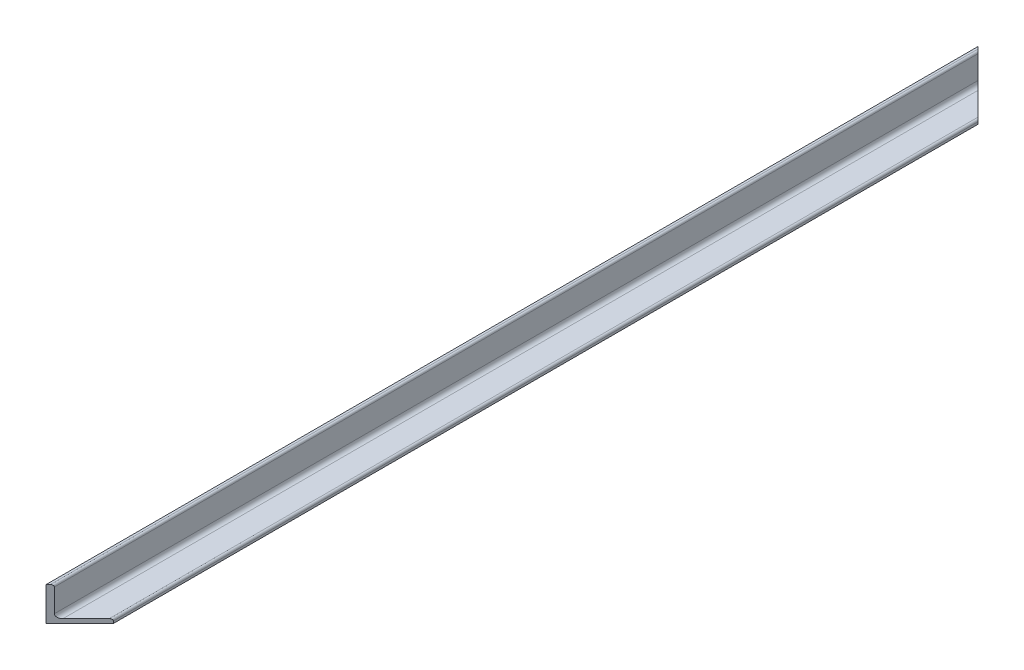
ISO-10303-21;
HEADER;
FILE_DESCRIPTION(('STEP AP214'),'2;1');
FILE_NAME('part.step','',(''),(''),'','','');
FILE_SCHEMA(('AUTOMOTIVE_DESIGN { 1 0 10303 214 1 1 1 1 }'));
ENDSEC;
DATA;
#1=APPLICATION_CONTEXT('core data for automotive mechanical design processes');
#2=APPLICATION_PROTOCOL_DEFINITION('international standard','automotive_design',2000,#1);
#3=PRODUCT_CONTEXT('',#1,'mechanical');
#4=PRODUCT('Part','Part','',(#3));
#5=PRODUCT_RELATED_PRODUCT_CATEGORY('part','',(#4));
#6=PRODUCT_DEFINITION_FORMATION('','',#4);
#7=PRODUCT_DEFINITION_CONTEXT('part definition',#1,'design');
#8=PRODUCT_DEFINITION('design','',#6,#7);
#9=PRODUCT_DEFINITION_SHAPE('','',#8);
#10=(LENGTH_UNIT() NAMED_UNIT(*) SI_UNIT(.MILLI.,.METRE.));
#11=(NAMED_UNIT(*) PLANE_ANGLE_UNIT() SI_UNIT($,.RADIAN.));
#12=(NAMED_UNIT(*) SI_UNIT($,.STERADIAN.) SOLID_ANGLE_UNIT());
#13=UNCERTAINTY_MEASURE_WITH_UNIT(LENGTH_MEASURE(1.E-05),#10,'distance_accuracy_value','');
#14=(GEOMETRIC_REPRESENTATION_CONTEXT(3) GLOBAL_UNCERTAINTY_ASSIGNED_CONTEXT((#13)) GLOBAL_UNIT_ASSIGNED_CONTEXT((#10,
#11,#12)) REPRESENTATION_CONTEXT('',''));
#15=CARTESIAN_POINT('',(0.,0.,0.));
#16=DIRECTION('',(0.,0.,1.));
#17=DIRECTION('',(1.,0.,0.));
#18=AXIS2_PLACEMENT_3D('',#15,#16,#17);
#19=CARTESIAN_POINT('',(-4.99999762E-08,0.,4.99999762E-08));
#20=DIRECTION('',(-0.707106781186547,0.,0.707106781186548));
#21=DIRECTION('',(0.707106781186548,0.,0.707106781186547));
#22=AXIS2_PLACEMENT_3D('',#19,#20,#21);
#23=PLANE('',#22);
#24=DIRECTION('',(-0.707106781186548,0.,-0.707106781186547));
#25=VECTOR('',#24,1.);
#26=CARTESIAN_POINT('',(2.4765,38.1,2.47650009999995));
#27=LINE('',#26,#25);
#28=CARTESIAN_POINT('',(2.4765,38.1,2.47650009999995));
#29=VERTEX_POINT('',#28);
#30=CARTESIAN_POINT('',(-1.22995654402062E-08,38.1,3.33697533511504E-08));
#31=VERTEX_POINT('',#30);
#32=EDGE_CURVE('E34',#29,#31,#27,.T.);
#33=ORIENTED_EDGE('',*,*,#32,.F.);
#34=CARTESIAN_POINT('',(2.4765,35.814,2.47650009999995));
#35=DIRECTION('',(-0.707106781186547,0.,0.707106781186548));
#36=DIRECTION('',(-0.707106781186548,0.,-0.707106781186547));
#37=AXIS2_PLACEMENT_3D('',#34,#35,#36);
#38=ELLIPSE('',#37,3.23289220358488,2.286);
#39=CARTESIAN_POINT('',(4.7625,35.814,4.76250009999995));
#40=VERTEX_POINT('',#39);
#41=EDGE_CURVE('E130',#40,#29,#38,.T.);
#42=ORIENTED_EDGE('',*,*,#41,.F.);
#43=DIRECTION('',(0.,1.,0.));
#44=VECTOR('',#43,1.);
#45=CARTESIAN_POINT('',(4.7625,9.5885,4.76250009999995));
#46=LINE('',#45,#44);
#47=CARTESIAN_POINT('',(4.7625,9.5885,4.76250009999995));
#48=VERTEX_POINT('',#47);
#49=EDGE_CURVE('E137',#48,#40,#46,.T.);
#50=ORIENTED_EDGE('',*,*,#49,.F.);
#51=CARTESIAN_POINT('',(9.5885,9.5885,9.58850009999995));
#52=DIRECTION('',(0.707106781186547,0.,-0.707106781186548));
#53=DIRECTION('',(-0.707106781186548,0.,-0.707106781186547));
#54=AXIS2_PLACEMENT_3D('',#51,#52,#53);
#55=ELLIPSE('',#54,6.82499465201256,4.826);
#56=CARTESIAN_POINT('',(9.5885,4.7625,9.58850009999995));
#57=VERTEX_POINT('',#56);
#58=EDGE_CURVE('E144',#57,#48,#55,.T.);
#59=ORIENTED_EDGE('',*,*,#58,.F.);
#60=DIRECTION('',(-0.707106781186548,0.,-0.707106781186547));
#61=VECTOR('',#60,1.);
#62=CARTESIAN_POINT('',(35.814,4.7625,35.8140000999999));
#63=LINE('',#62,#61);
#64=CARTESIAN_POINT('',(35.814,4.7625,35.8140000999999));
#65=VERTEX_POINT('',#64);
#66=EDGE_CURVE('E26',#65,#57,#63,.T.);
#67=ORIENTED_EDGE('',*,*,#66,.F.);
#68=CARTESIAN_POINT('',(35.814,2.47650000000003,35.8140000999999));
#69=DIRECTION('',(-0.707106781186547,0.,0.707106781186548));
#70=DIRECTION('',(-0.707106781186548,0.,-0.707106781186547));
#71=AXIS2_PLACEMENT_3D('',#68,#69,#70);
#72=ELLIPSE('',#71,3.23289220358488,2.286);
#73=CARTESIAN_POINT('',(38.1,2.47650000000003,38.1000000999999));
#74=VERTEX_POINT('',#73);
#75=EDGE_CURVE('E123',#74,#65,#72,.T.);
#76=ORIENTED_EDGE('',*,*,#75,.F.);
#77=DIRECTION('',(0.,1.,0.));
#78=VECTOR('',#77,1.);
#79=CARTESIAN_POINT('',(38.1,0.,38.1000001));
#80=LINE('',#79,#78);
#81=CARTESIAN_POINT('',(38.1,0.,38.1000000999999));
#82=VERTEX_POINT('',#81);
#83=EDGE_CURVE('E102',#82,#74,#80,.T.);
#84=ORIENTED_EDGE('',*,*,#83,.F.);
#85=DIRECTION('',(0.707106781186548,0.,0.707106781186547));
#86=VECTOR('',#85,1.);
#87=CARTESIAN_POINT('',(-4.99999773102231E-08,0.,4.9999975089777E-08));
#88=LINE('',#87,#86);
#89=CARTESIAN_POINT('',(-1.2299562351499E-08,0.,3.33697530782527E-08));
#90=VERTEX_POINT('',#89);
#91=EDGE_CURVE('E95',#90,#82,#88,.T.);
#92=ORIENTED_EDGE('',*,*,#91,.F.);
#93=DIRECTION('',(0.,1.,0.));
#94=VECTOR('',#93,1.);
#95=CARTESIAN_POINT('',(0.,0.,0.));
#96=LINE('',#95,#94);
#97=EDGE_CURVE('E10',#90,#31,#96,.T.);
#98=ORIENTED_EDGE('',*,*,#97,.T.);
#99=EDGE_LOOP('',(#33,#42,#50,#59,#67,#76,#84,#92,#98));
#100=FACE_BOUND('',#99,.T.);
#101=ADVANCED_FACE('F16',(#100),#23,.F.);
#102=CARTESIAN_POINT('',(9.5885,4.7625,0.));
#103=DIRECTION('',(0.,1.,0.));
#104=DIRECTION('',(0.,0.,1.));
#105=AXIS2_PLACEMENT_3D('',#102,#103,#104);
#106=PLANE('',#105);
#107=ORIENTED_EDGE('',*,*,#66,.T.);
#108=DIRECTION('',(0.,0.,1.));
#109=VECTOR('',#108,1.);
#110=CARTESIAN_POINT('',(9.5885,4.7625,9.58850009999995));
#111=LINE('',#110,#109);
#112=CARTESIAN_POINT('',(9.5885,4.7625,1044.5114999));
#113=VERTEX_POINT('',#112);
#114=EDGE_CURVE('E148',#57,#113,#111,.T.);
#115=ORIENTED_EDGE('',*,*,#114,.T.);
#116=DIRECTION('',(0.707106781186548,0.,-0.707106781186547));
#117=VECTOR('',#116,1.);
#118=CARTESIAN_POINT('',(9.58849999999993,4.7625,1044.5114999));
#119=LINE('',#118,#117);
#120=CARTESIAN_POINT('',(35.814,4.7625,1018.2859999));
#121=VERTEX_POINT('',#120);
#122=EDGE_CURVE('E146',#113,#121,#119,.T.);
#123=ORIENTED_EDGE('',*,*,#122,.T.);
#124=DIRECTION('',(0.,0.,1.));
#125=VECTOR('',#124,1.);
#126=CARTESIAN_POINT('',(35.814,4.7625,35.8140000999999));
#127=LINE('',#126,#125);
#128=EDGE_CURVE('E100',#65,#121,#127,.T.);
#129=ORIENTED_EDGE('',*,*,#128,.F.);
#130=EDGE_LOOP('',(#107,#115,#123,#129));
#131=FACE_BOUND('',#130,.T.);
#132=ADVANCED_FACE('F179',(#131),#106,.T.);
#133=CARTESIAN_POINT('',(9.5885,9.5885,0.));
#134=DIRECTION('',(0.,0.,1.));
#135=DIRECTION('',(1.,0.,0.));
#136=AXIS2_PLACEMENT_3D('',#133,#134,#135);
#137=CYLINDRICAL_SURFACE('',#136,4.826);
#138=ORIENTED_EDGE('',*,*,#58,.T.);
#139=DIRECTION('',(0.,0.,1.));
#140=VECTOR('',#139,1.);
#141=CARTESIAN_POINT('',(4.7625,9.5885,4.76250009999995));
#142=LINE('',#141,#140);
#143=CARTESIAN_POINT('',(4.7625,9.5885,1049.3374999));
#144=VERTEX_POINT('',#143);
#145=EDGE_CURVE('E141',#48,#144,#142,.T.);
#146=ORIENTED_EDGE('',*,*,#145,.T.);
#147=CARTESIAN_POINT('',(9.5885,9.5885,1044.5114999));
#148=DIRECTION('',(0.707106781186548,0.,0.707106781186548));
#149=DIRECTION('',(-0.707106781186548,0.,0.707106781186548));
#150=AXIS2_PLACEMENT_3D('',#147,#148,#149);
#151=ELLIPSE('',#150,6.82499465201256,4.826);
#152=EDGE_CURVE('E138',#144,#113,#151,.T.);
#153=ORIENTED_EDGE('',*,*,#152,.T.);
#154=ORIENTED_EDGE('',*,*,#114,.F.);
#155=EDGE_LOOP('',(#138,#146,#153,#154));
#156=FACE_BOUND('',#155,.T.);
#157=ADVANCED_FACE('F175',(#156),#137,.F.);
#158=CARTESIAN_POINT('',(4.7625,35.814,0.));
#159=DIRECTION('',(1.,0.,0.));
#160=DIRECTION('',(0.,0.,-1.));
#161=AXIS2_PLACEMENT_3D('',#158,#159,#160);
#162=PLANE('',#161);
#163=ORIENTED_EDGE('',*,*,#49,.T.);
#164=DIRECTION('',(0.,0.,1.));
#165=VECTOR('',#164,1.);
#166=CARTESIAN_POINT('',(4.7625,35.814,4.76250009999995));
#167=LINE('',#166,#165);
#168=CARTESIAN_POINT('',(4.7625,35.814,1049.3374999));
#169=VERTEX_POINT('',#168);
#170=EDGE_CURVE('E134',#40,#169,#167,.T.);
#171=ORIENTED_EDGE('',*,*,#170,.T.);
#172=DIRECTION('',(0.,-1.,0.));
#173=VECTOR('',#172,1.);
#174=CARTESIAN_POINT('',(4.7625,35.814,1049.3374999));
#175=LINE('',#174,#173);
#176=EDGE_CURVE('E131',#169,#144,#175,.T.);
#177=ORIENTED_EDGE('',*,*,#176,.T.);
#178=ORIENTED_EDGE('',*,*,#145,.F.);
#179=EDGE_LOOP('',(#163,#171,#177,#178));
#180=FACE_BOUND('',#179,.T.);
#181=ADVANCED_FACE('F173',(#180),#162,.T.);
#182=CARTESIAN_POINT('',(2.4765,35.814,0.));
#183=DIRECTION('',(0.,0.,1.));
#184=DIRECTION('',(1.,0.,0.));
#185=AXIS2_PLACEMENT_3D('',#182,#183,#184);
#186=CYLINDRICAL_SURFACE('',#185,2.286);
#187=ORIENTED_EDGE('',*,*,#41,.T.);
#188=DIRECTION('',(0.,0.,1.));
#189=VECTOR('',#188,1.);
#190=CARTESIAN_POINT('',(2.4765,38.1,2.47650009999995));
#191=LINE('',#190,#189);
#192=CARTESIAN_POINT('',(2.4765,38.1,1051.6234999));
#193=VERTEX_POINT('',#192);
#194=EDGE_CURVE('E127',#29,#193,#191,.T.);
#195=ORIENTED_EDGE('',*,*,#194,.T.);
#196=CARTESIAN_POINT('',(2.4765,35.814,1051.6234999));
#197=DIRECTION('',(-0.707106781186548,0.,-0.707106781186548));
#198=DIRECTION('',(-0.707106781186548,0.,0.707106781186548));
#199=AXIS2_PLACEMENT_3D('',#196,#197,#198);
#200=ELLIPSE('',#199,3.23289220358491,2.286);
#201=EDGE_CURVE('E124',#193,#169,#200,.T.);
#202=ORIENTED_EDGE('',*,*,#201,.T.);
#203=ORIENTED_EDGE('',*,*,#170,.F.);
#204=EDGE_LOOP('',(#187,#195,#202,#203));
#205=FACE_BOUND('',#204,.T.);
#206=ADVANCED_FACE('F170',(#205),#186,.T.);
#207=CARTESIAN_POINT('',(527.04999995,0.,527.04999995));
#208=DIRECTION('',(-0.707106781186548,0.,-0.707106781186547));
#209=DIRECTION('',(-0.707106781186547,0.,0.707106781186548));
#210=AXIS2_PLACEMENT_3D('',#207,#208,#209);
#211=PLANE('',#210);
#212=ORIENTED_EDGE('',*,*,#122,.F.);
#213=ORIENTED_EDGE('',*,*,#152,.F.);
#214=ORIENTED_EDGE('',*,*,#176,.F.);
#215=ORIENTED_EDGE('',*,*,#201,.F.);
#216=DIRECTION('',(0.707106781186526,0.,-0.707106781186569));
#217=VECTOR('',#216,1.);
#218=CARTESIAN_POINT('',(-5.00000797771497E-08,38.1,1054.09999995));
#219=LINE('',#218,#217);
#220=CARTESIAN_POINT('',(-1.22995897440961E-08,38.1,1054.09999996663));
#221=VERTEX_POINT('',#220);
#222=EDGE_CURVE('E120',#221,#193,#219,.T.);
#223=ORIENTED_EDGE('',*,*,#222,.F.);
#224=DIRECTION('',(0.,1.,0.));
#225=VECTOR('',#224,1.);
#226=CARTESIAN_POINT('',(0.,0.,1054.1));
#227=LINE('',#226,#225);
#228=CARTESIAN_POINT('',(-1.22995893100016E-08,0.,1054.09999996663));
#229=VERTEX_POINT('',#228);
#230=EDGE_CURVE('E114',#229,#221,#227,.T.);
#231=ORIENTED_EDGE('',*,*,#230,.F.);
#232=DIRECTION('',(-0.707106781186546,0.,0.707106781186549));
#233=VECTOR('',#232,1.);
#234=CARTESIAN_POINT('',(38.1,0.,1015.9999999));
#235=LINE('',#234,#233);
#236=CARTESIAN_POINT('',(38.1,0.,1015.9999999));
#237=VERTEX_POINT('',#236);
#238=EDGE_CURVE('E83',#237,#229,#235,.T.);
#239=ORIENTED_EDGE('',*,*,#238,.F.);
#240=DIRECTION('',(0.,-1.,0.));
#241=VECTOR('',#240,1.);
#242=CARTESIAN_POINT('',(38.1,2.47650000000003,1015.9999999));
#243=LINE('',#242,#241);
#244=CARTESIAN_POINT('',(38.1,2.47650000000003,1015.9999999));
#245=VERTEX_POINT('',#244);
#246=EDGE_CURVE('E86',#245,#237,#243,.T.);
#247=ORIENTED_EDGE('',*,*,#246,.F.);
#248=CARTESIAN_POINT('',(35.814,2.47650000000003,1018.2859999));
#249=DIRECTION('',(-0.707106781186548,0.,-0.707106781186547));
#250=DIRECTION('',(-0.707106781186547,0.,0.707106781186548));
#251=AXIS2_PLACEMENT_3D('',#248,#249,#250);
#252=ELLIPSE('',#251,3.23289220358491,2.286);
#253=EDGE_CURVE('E89',#121,#245,#252,.T.);
#254=ORIENTED_EDGE('',*,*,#253,.F.);
#255=EDGE_LOOP('',(#212,#213,#214,#215,#223,#231,#239,#247,#254));
#256=FACE_BOUND('',#255,.T.);
#257=ADVANCED_FACE('F88',(#256),#211,.F.);
#258=CARTESIAN_POINT('',(0.,38.1,0.));
#259=DIRECTION('',(0.,1.,0.));
#260=DIRECTION('',(0.,0.,1.));
#261=AXIS2_PLACEMENT_3D('',#258,#259,#260);
#262=PLANE('',#261);
#263=ORIENTED_EDGE('',*,*,#32,.T.);
#264=DIRECTION('',(0.,0.,1.));
#265=VECTOR('',#264,1.);
#266=CARTESIAN_POINT('',(0.,38.1,0.));
#267=LINE('',#266,#265);
#268=EDGE_CURVE('E110',#31,#221,#267,.T.);
#269=ORIENTED_EDGE('',*,*,#268,.T.);
#270=ORIENTED_EDGE('',*,*,#222,.T.);
#271=ORIENTED_EDGE('',*,*,#194,.F.);
#272=EDGE_LOOP('',(#263,#269,#270,#271));
#273=FACE_BOUND('',#272,.T.);
#274=ADVANCED_FACE('F163',(#273),#262,.T.);
#275=CARTESIAN_POINT('',(35.814,2.47650000000003,0.));
#276=DIRECTION('',(0.,0.,1.));
#277=DIRECTION('',(1.,0.,0.));
#278=AXIS2_PLACEMENT_3D('',#275,#276,#277);
#279=CYLINDRICAL_SURFACE('',#278,2.286);
#280=ORIENTED_EDGE('',*,*,#75,.T.);
#281=ORIENTED_EDGE('',*,*,#128,.T.);
#282=ORIENTED_EDGE('',*,*,#253,.T.);
#283=DIRECTION('',(0.,0.,1.));
#284=VECTOR('',#283,1.);
#285=CARTESIAN_POINT('',(38.1,2.47650000000003,38.1000000999999));
#286=LINE('',#285,#284);
#287=EDGE_CURVE('E94',#74,#245,#286,.T.);
#288=ORIENTED_EDGE('',*,*,#287,.F.);
#289=EDGE_LOOP('',(#280,#281,#282,#288));
#290=FACE_BOUND('',#289,.T.);
#291=ADVANCED_FACE('F18',(#290),#279,.T.);
#292=CARTESIAN_POINT('',(38.1,2.47650000000003,0.));
#293=DIRECTION('',(1.,0.,0.));
#294=DIRECTION('',(0.,0.,-1.));
#295=AXIS2_PLACEMENT_3D('',#292,#293,#294);
#296=PLANE('',#295);
#297=ORIENTED_EDGE('',*,*,#83,.T.);
#298=ORIENTED_EDGE('',*,*,#287,.T.);
#299=ORIENTED_EDGE('',*,*,#246,.T.);
#300=DIRECTION('',(0.,0.,1.));
#301=VECTOR('',#300,1.);
#302=CARTESIAN_POINT('',(38.1,0.,38.1000000999999));
#303=LINE('',#302,#301);
#304=EDGE_CURVE('E111',#82,#237,#303,.T.);
#305=ORIENTED_EDGE('',*,*,#304,.F.);
#306=EDGE_LOOP('',(#297,#298,#299,#305));
#307=FACE_BOUND('',#306,.T.);
#308=ADVANCED_FACE('F104',(#307),#296,.T.);
#309=CARTESIAN_POINT('',(38.1,0.,0.));
#310=DIRECTION('',(0.,-1.,0.));
#311=DIRECTION('',(0.,0.,-1.));
#312=AXIS2_PLACEMENT_3D('',#309,#310,#311);
#313=PLANE('',#312);
#314=ORIENTED_EDGE('',*,*,#91,.T.);
#315=ORIENTED_EDGE('',*,*,#304,.T.);
#316=ORIENTED_EDGE('',*,*,#238,.T.);
#317=DIRECTION('',(0.,0.,1.));
#318=VECTOR('',#317,1.);
#319=CARTESIAN_POINT('',(0.,0.,0.));
#320=LINE('',#319,#318);
#321=EDGE_CURVE('E20',#90,#229,#320,.T.);
#322=ORIENTED_EDGE('',*,*,#321,.F.);
#323=EDGE_LOOP('',(#314,#315,#316,#322));
#324=FACE_BOUND('',#323,.T.);
#325=ADVANCED_FACE('F198',(#324),#313,.T.);
#326=CARTESIAN_POINT('',(0.,0.,0.));
#327=DIRECTION('',(-1.,0.,0.));
#328=DIRECTION('',(0.,0.,1.));
#329=AXIS2_PLACEMENT_3D('',#326,#327,#328);
#330=PLANE('',#329);
#331=ORIENTED_EDGE('',*,*,#230,.T.);
#332=ORIENTED_EDGE('',*,*,#268,.F.);
#333=ORIENTED_EDGE('',*,*,#97,.F.);
#334=ORIENTED_EDGE('',*,*,#321,.T.);
#335=EDGE_LOOP('',(#331,#332,#333,#334));
#336=FACE_BOUND('',#335,.T.);
#337=ADVANCED_FACE('F167',(#336),#330,.T.);
#338=CLOSED_SHELL('',(#101,#132,#157,#181,#206,#257,#274,#291,#308,#325,#337));
#339=MANIFOLD_SOLID_BREP('B1',#338);
#340=ADVANCED_BREP_SHAPE_REPRESENTATION('',(#18,#339),#14);
#341=SHAPE_DEFINITION_REPRESENTATION(#9,#340);
ENDSEC;
END-ISO-10303-21;
